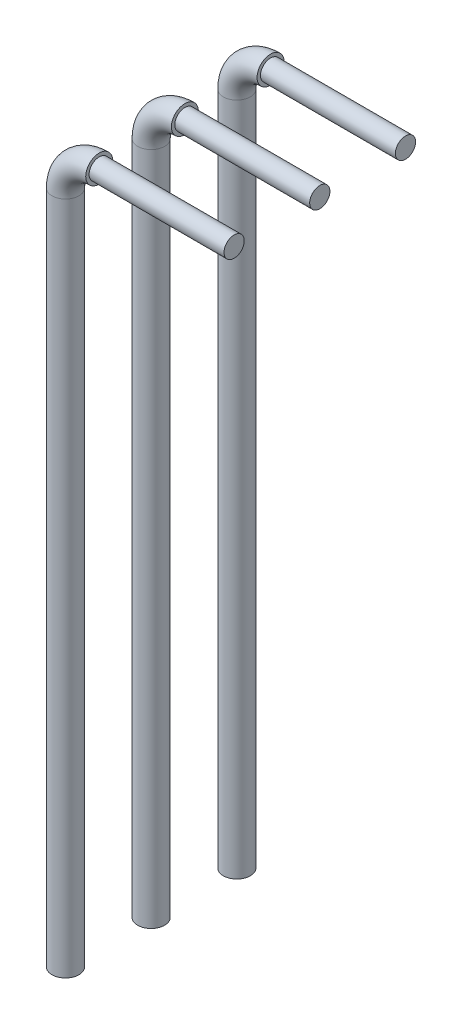
ISO-10303-21;
HEADER;
FILE_DESCRIPTION(('STEP AP214'),'2;1');
FILE_NAME('part.step','',(''),(''),'','','');
FILE_SCHEMA(('AUTOMOTIVE_DESIGN { 1 0 10303 214 1 1 1 1 }'));
ENDSEC;
DATA;
#1=APPLICATION_CONTEXT('core data for automotive mechanical design processes');
#2=APPLICATION_PROTOCOL_DEFINITION('international standard','automotive_design',2000,#1);
#3=PRODUCT_CONTEXT('',#1,'mechanical');
#4=PRODUCT('Part','Part','',(#3));
#5=PRODUCT_RELATED_PRODUCT_CATEGORY('part','',(#4));
#6=PRODUCT_DEFINITION_FORMATION('','',#4);
#7=PRODUCT_DEFINITION_CONTEXT('part definition',#1,'design');
#8=PRODUCT_DEFINITION('design','',#6,#7);
#9=PRODUCT_DEFINITION_SHAPE('','',#8);
#10=(LENGTH_UNIT() NAMED_UNIT(*) SI_UNIT(.MILLI.,.METRE.));
#11=(NAMED_UNIT(*) PLANE_ANGLE_UNIT() SI_UNIT($,.RADIAN.));
#12=(NAMED_UNIT(*) SI_UNIT($,.STERADIAN.) SOLID_ANGLE_UNIT());
#13=UNCERTAINTY_MEASURE_WITH_UNIT(LENGTH_MEASURE(1.E-05),#10,'distance_accuracy_value','');
#14=(GEOMETRIC_REPRESENTATION_CONTEXT(3) GLOBAL_UNCERTAINTY_ASSIGNED_CONTEXT((#13)) GLOBAL_UNIT_ASSIGNED_CONTEXT((#10,
#11,#12)) REPRESENTATION_CONTEXT('',''));
#15=CARTESIAN_POINT('',(0.,0.,0.));
#16=DIRECTION('',(0.,0.,1.));
#17=DIRECTION('',(1.,0.,0.));
#18=AXIS2_PLACEMENT_3D('',#15,#16,#17);
#19=CARTESIAN_POINT('',(1.0007043784199,20.9999997519255,-5.08));
#20=DIRECTION('',(0.99999975192549,-0.000704378419902238,0.));
#21=DIRECTION('',(0.,0.,1.));
#22=AXIS2_PLACEMENT_3D('',#19,#20,#21);
#23=PLANE('',#22);
#24=CARTESIAN_POINT('',(1.0007043784199,20.9999997519255,-5.08));
#25=DIRECTION('',(0.99999975192549,-0.000704378419902238,0.));
#26=DIRECTION('',(0.,0.,1.));
#27=AXIS2_PLACEMENT_3D('',#24,#25,#26);
#28=CIRCLE('',#27,0.4);
#29=CARTESIAN_POINT('',(1.00098612978786,21.3999996526957,-5.08));
#30=VERTEX_POINT('',#29);
#31=EDGE_CURVE('E11',#30,#30,#28,.T.);
#32=ORIENTED_EDGE('',*,*,#31,.T.);
#33=EDGE_LOOP('',(#32));
#34=FACE_BOUND('',#33,.T.);
#35=CARTESIAN_POINT('',(1.0007043784199,20.9999997519255,-5.08));
#36=DIRECTION('',(0.99999975192549,-0.000704378419902238,0.));
#37=DIRECTION('',(0.000704378419902238,0.99999975192549,0.));
#38=AXIS2_PLACEMENT_3D('',#35,#36,#37);
#39=CIRCLE('',#38,0.3);
#40=CARTESIAN_POINT('',(1.00091569194587,21.2999996775031,-5.08));
#41=VERTEX_POINT('',#40);
#42=EDGE_CURVE('E61',#41,#41,#39,.T.);
#43=ORIENTED_EDGE('',*,*,#42,.F.);
#44=EDGE_LOOP('',(#43));
#45=FACE_BOUND('',#44,.T.);
#46=ADVANCED_FACE('F43',(#34,#45),#23,.T.);
#47=CARTESIAN_POINT('',(1.,20.,-5.08));
#48=DIRECTION('',(0.,0.,-1.));
#49=DIRECTION('',(-1.,0.,0.));
#50=AXIS2_PLACEMENT_3D('',#47,#48,#49);
#51=TOROIDAL_SURFACE('',#50,1.,0.4);
#52=CARTESIAN_POINT('',(0.,20.,-5.08));
#53=DIRECTION('',(0.,1.,0.));
#54=DIRECTION('',(0.,0.,1.));
#55=AXIS2_PLACEMENT_3D('',#52,#53,#54);
#56=CIRCLE('',#55,0.4);
#57=CARTESIAN_POINT('',(-0.4,20.,-5.08));
#58=VERTEX_POINT('',#57);
#59=EDGE_CURVE('E50',#58,#58,#56,.T.);
#60=CARTESIAN_POINT('',(1.,20.,-5.08));
#61=DIRECTION('',(0.,0.,-1.));
#62=DIRECTION('',(-1.,0.,0.));
#63=AXIS2_PLACEMENT_3D('',#60,#61,#62);
#64=CIRCLE('',#63,1.4);
#65=EDGE_CURVE('',#58,#30,#64,.T.);
#66=ORIENTED_EDGE('',*,*,#59,.T.);
#67=ORIENTED_EDGE('',*,*,#31,.F.);
#68=ORIENTED_EDGE('',*,*,#65,.T.);
#69=ORIENTED_EDGE('',*,*,#65,.F.);
#70=EDGE_LOOP('',(#66,#68,#67,#69));
#71=FACE_BOUND('',#70,.T.);
#72=ADVANCED_FACE('F45',(#71),#51,.T.);
#73=CARTESIAN_POINT('',(0.,20.,-5.08));
#74=DIRECTION('',(0.,-1.,0.));
#75=DIRECTION('',(0.,0.,-1.));
#76=AXIS2_PLACEMENT_3D('',#73,#74,#75);
#77=CYLINDRICAL_SURFACE('',#76,0.4);
#78=ORIENTED_EDGE('',*,*,#59,.F.);
#79=EDGE_LOOP('',(#78));
#80=FACE_BOUND('',#79,.T.);
#81=CARTESIAN_POINT('',(0.,0.,-5.08));
#82=DIRECTION('',(0.,1.,0.));
#83=DIRECTION('',(0.,0.,1.));
#84=AXIS2_PLACEMENT_3D('',#81,#82,#83);
#85=CIRCLE('',#84,0.4);
#86=CARTESIAN_POINT('',(0.,0.,-4.68));
#87=VERTEX_POINT('',#86);
#88=EDGE_CURVE('E54',#87,#87,#85,.T.);
#89=ORIENTED_EDGE('',*,*,#88,.T.);
#90=EDGE_LOOP('',(#89));
#91=FACE_BOUND('',#90,.T.);
#92=ADVANCED_FACE('F81',(#80,#91),#77,.T.);
#93=CARTESIAN_POINT('',(0.,0.,-5.08));
#94=DIRECTION('',(0.,1.,0.));
#95=DIRECTION('',(0.,0.,1.));
#96=AXIS2_PLACEMENT_3D('',#93,#94,#95);
#97=PLANE('',#96);
#98=ORIENTED_EDGE('',*,*,#88,.F.);
#99=EDGE_LOOP('',(#98));
#100=FACE_BOUND('',#99,.T.);
#101=ADVANCED_FACE('F72',(#100),#97,.F.);
#102=CARTESIAN_POINT('',(5.00070338612186,20.9971822382459,-5.08));
#103=DIRECTION('',(-0.99999975192549,0.000704378419902238,0.));
#104=DIRECTION('',(-0.000704378419902238,-0.99999975192549,0.));
#105=AXIS2_PLACEMENT_3D('',#102,#103,#104);
#106=CYLINDRICAL_SURFACE('',#105,0.3);
#107=CARTESIAN_POINT('',(5.00070338612186,20.9971822382459,-5.08));
#108=DIRECTION('',(0.99999975192549,-0.000704378419902238,0.));
#109=DIRECTION('',(0.000704378419902238,0.99999975192549,0.));
#110=AXIS2_PLACEMENT_3D('',#107,#108,#109);
#111=CIRCLE('',#110,0.3);
#112=CARTESIAN_POINT('',(5.00091469964783,21.2971821638235,-5.08));
#113=VERTEX_POINT('',#112);
#114=EDGE_CURVE('E59',#113,#113,#111,.T.);
#115=ORIENTED_EDGE('',*,*,#114,.F.);
#116=EDGE_LOOP('',(#115));
#117=FACE_BOUND('',#116,.T.);
#118=ORIENTED_EDGE('',*,*,#42,.T.);
#119=EDGE_LOOP('',(#118));
#120=FACE_BOUND('',#119,.T.);
#121=ADVANCED_FACE('F69',(#117,#120),#106,.T.);
#122=CARTESIAN_POINT('',(5.00070338612186,20.9971822382459,-5.08));
#123=DIRECTION('',(0.99999975192549,-0.000704378419902238,0.));
#124=DIRECTION('',(0.000704378419902238,0.99999975192549,0.));
#125=AXIS2_PLACEMENT_3D('',#122,#123,#124);
#126=PLANE('',#125);
#127=ORIENTED_EDGE('',*,*,#114,.T.);
#128=EDGE_LOOP('',(#127));
#129=FACE_BOUND('',#128,.T.);
#130=ADVANCED_FACE('F67',(#129),#126,.T.);
#131=CLOSED_SHELL('',(#46,#72,#92,#101,#121,#130));
#132=MANIFOLD_SOLID_BREP('B2',#131);
#133=CARTESIAN_POINT('',(1.0007043784199,20.9999997519255,-2.54));
#134=DIRECTION('',(0.99999975192549,-0.000704378419902238,0.));
#135=DIRECTION('',(0.,0.,1.));
#136=AXIS2_PLACEMENT_3D('',#133,#134,#135);
#137=PLANE('',#136);
#138=CARTESIAN_POINT('',(1.0007043784199,20.9999997519255,-2.54));
#139=DIRECTION('',(0.99999975192549,-0.000704378419902238,0.));
#140=DIRECTION('',(0.,0.,1.));
#141=AXIS2_PLACEMENT_3D('',#138,#139,#140);
#142=CIRCLE('',#141,0.4);
#143=CARTESIAN_POINT('',(1.00098612978786,21.3999996526957,-2.54));
#144=VERTEX_POINT('',#143);
#145=EDGE_CURVE('E42',#144,#144,#142,.T.);
#146=ORIENTED_EDGE('',*,*,#145,.T.);
#147=EDGE_LOOP('',(#146));
#148=FACE_BOUND('',#147,.T.);
#149=CARTESIAN_POINT('',(1.0007043784199,20.9999997519255,-2.54));
#150=DIRECTION('',(0.99999975192549,-0.000704378419902238,0.));
#151=DIRECTION('',(0.000704378419902238,0.99999975192549,0.));
#152=AXIS2_PLACEMENT_3D('',#149,#150,#151);
#153=CIRCLE('',#152,0.3);
#154=CARTESIAN_POINT('',(1.00091569194587,21.2999996775031,-2.54));
#155=VERTEX_POINT('',#154);
#156=EDGE_CURVE('E165',#155,#155,#153,.T.);
#157=ORIENTED_EDGE('',*,*,#156,.F.);
#158=EDGE_LOOP('',(#157));
#159=FACE_BOUND('',#158,.T.);
#160=ADVANCED_FACE('F147',(#148,#159),#137,.T.);
#161=CARTESIAN_POINT('',(1.,20.,-2.54));
#162=DIRECTION('',(0.,0.,-1.));
#163=DIRECTION('',(-1.,0.,0.));
#164=AXIS2_PLACEMENT_3D('',#161,#162,#163);
#165=TOROIDAL_SURFACE('',#164,1.,0.4);
#166=CARTESIAN_POINT('',(0.,20.,-2.54));
#167=DIRECTION('',(0.,1.,0.));
#168=DIRECTION('',(0.,0.,1.));
#169=AXIS2_PLACEMENT_3D('',#166,#167,#168);
#170=CIRCLE('',#169,0.4);
#171=CARTESIAN_POINT('',(-0.4,20.,-2.54));
#172=VERTEX_POINT('',#171);
#173=EDGE_CURVE('E154',#172,#172,#170,.T.);
#174=CARTESIAN_POINT('',(1.,20.,-2.54));
#175=DIRECTION('',(0.,0.,-1.));
#176=DIRECTION('',(-1.,0.,0.));
#177=AXIS2_PLACEMENT_3D('',#174,#175,#176);
#178=CIRCLE('',#177,1.4);
#179=EDGE_CURVE('',#172,#144,#178,.T.);
#180=ORIENTED_EDGE('',*,*,#173,.T.);
#181=ORIENTED_EDGE('',*,*,#145,.F.);
#182=ORIENTED_EDGE('',*,*,#179,.T.);
#183=ORIENTED_EDGE('',*,*,#179,.F.);
#184=EDGE_LOOP('',(#180,#182,#181,#183));
#185=FACE_BOUND('',#184,.T.);
#186=ADVANCED_FACE('F149',(#185),#165,.T.);
#187=CARTESIAN_POINT('',(0.,20.,-2.54));
#188=DIRECTION('',(0.,-1.,0.));
#189=DIRECTION('',(0.,0.,-1.));
#190=AXIS2_PLACEMENT_3D('',#187,#188,#189);
#191=CYLINDRICAL_SURFACE('',#190,0.4);
#192=ORIENTED_EDGE('',*,*,#173,.F.);
#193=EDGE_LOOP('',(#192));
#194=FACE_BOUND('',#193,.T.);
#195=CARTESIAN_POINT('',(0.,0.,-2.54));
#196=DIRECTION('',(0.,1.,0.));
#197=DIRECTION('',(0.,0.,1.));
#198=AXIS2_PLACEMENT_3D('',#195,#196,#197);
#199=CIRCLE('',#198,0.4);
#200=CARTESIAN_POINT('',(0.,0.,-2.14));
#201=VERTEX_POINT('',#200);
#202=EDGE_CURVE('E158',#201,#201,#199,.T.);
#203=ORIENTED_EDGE('',*,*,#202,.T.);
#204=EDGE_LOOP('',(#203));
#205=FACE_BOUND('',#204,.T.);
#206=ADVANCED_FACE('F185',(#194,#205),#191,.T.);
#207=CARTESIAN_POINT('',(0.,0.,-2.54));
#208=DIRECTION('',(0.,1.,0.));
#209=DIRECTION('',(0.,0.,1.));
#210=AXIS2_PLACEMENT_3D('',#207,#208,#209);
#211=PLANE('',#210);
#212=ORIENTED_EDGE('',*,*,#202,.F.);
#213=EDGE_LOOP('',(#212));
#214=FACE_BOUND('',#213,.T.);
#215=ADVANCED_FACE('F176',(#214),#211,.F.);
#216=CARTESIAN_POINT('',(5.00070338612186,20.9971822382459,-2.54));
#217=DIRECTION('',(-0.99999975192549,0.000704378419902238,0.));
#218=DIRECTION('',(-0.000704378419902238,-0.99999975192549,0.));
#219=AXIS2_PLACEMENT_3D('',#216,#217,#218);
#220=CYLINDRICAL_SURFACE('',#219,0.3);
#221=CARTESIAN_POINT('',(5.00070338612186,20.9971822382459,-2.54));
#222=DIRECTION('',(0.99999975192549,-0.000704378419902238,0.));
#223=DIRECTION('',(0.000704378419902238,0.99999975192549,0.));
#224=AXIS2_PLACEMENT_3D('',#221,#222,#223);
#225=CIRCLE('',#224,0.3);
#226=CARTESIAN_POINT('',(5.00091469964783,21.2971821638235,-2.54));
#227=VERTEX_POINT('',#226);
#228=EDGE_CURVE('E163',#227,#227,#225,.T.);
#229=ORIENTED_EDGE('',*,*,#228,.F.);
#230=EDGE_LOOP('',(#229));
#231=FACE_BOUND('',#230,.T.);
#232=ORIENTED_EDGE('',*,*,#156,.T.);
#233=EDGE_LOOP('',(#232));
#234=FACE_BOUND('',#233,.T.);
#235=ADVANCED_FACE('F173',(#231,#234),#220,.T.);
#236=CARTESIAN_POINT('',(5.00070338612186,20.9971822382459,-2.54));
#237=DIRECTION('',(0.99999975192549,-0.000704378419902238,0.));
#238=DIRECTION('',(0.000704378419902238,0.99999975192549,0.));
#239=AXIS2_PLACEMENT_3D('',#236,#237,#238);
#240=PLANE('',#239);
#241=ORIENTED_EDGE('',*,*,#228,.T.);
#242=EDGE_LOOP('',(#241));
#243=FACE_BOUND('',#242,.T.);
#244=ADVANCED_FACE('F171',(#243),#240,.T.);
#245=CLOSED_SHELL('',(#160,#186,#206,#215,#235,#244));
#246=MANIFOLD_SOLID_BREP('B6',#245);
#247=CARTESIAN_POINT('',(1.0007043784199,20.9999997519255,0.));
#248=DIRECTION('',(0.99999975192549,-0.000704378419902238,0.));
#249=DIRECTION('',(0.,0.,1.));
#250=AXIS2_PLACEMENT_3D('',#247,#248,#249);
#251=PLANE('',#250);
#252=CARTESIAN_POINT('',(1.0007043784199,20.9999997519255,0.));
#253=DIRECTION('',(0.99999975192549,-0.000704378419902238,0.));
#254=DIRECTION('',(0.,0.,1.));
#255=AXIS2_PLACEMENT_3D('',#252,#253,#254);
#256=CIRCLE('',#255,0.4);
#257=CARTESIAN_POINT('',(1.00098612978786,21.3999996526957,0.));
#258=VERTEX_POINT('',#257);
#259=EDGE_CURVE('E146',#258,#258,#256,.T.);
#260=ORIENTED_EDGE('',*,*,#259,.T.);
#261=EDGE_LOOP('',(#260));
#262=FACE_BOUND('',#261,.T.);
#263=CARTESIAN_POINT('',(1.0007043784199,20.9999997519255,0.));
#264=DIRECTION('',(0.99999975192549,-0.000704378419902238,0.));
#265=DIRECTION('',(0.000704378419902238,0.99999975192549,0.));
#266=AXIS2_PLACEMENT_3D('',#263,#264,#265);
#267=CIRCLE('',#266,0.3);
#268=CARTESIAN_POINT('',(1.00091569194587,21.2999996775031,0.));
#269=VERTEX_POINT('',#268);
#270=EDGE_CURVE('E262',#269,#269,#267,.T.);
#271=ORIENTED_EDGE('',*,*,#270,.F.);
#272=EDGE_LOOP('',(#271));
#273=FACE_BOUND('',#272,.T.);
#274=ADVANCED_FACE('F244',(#262,#273),#251,.T.);
#275=CARTESIAN_POINT('',(1.,20.,0.));
#276=DIRECTION('',(0.,0.,-1.));
#277=DIRECTION('',(-1.,0.,0.));
#278=AXIS2_PLACEMENT_3D('',#275,#276,#277);
#279=TOROIDAL_SURFACE('',#278,1.,0.4);
#280=CARTESIAN_POINT('',(0.,20.,0.));
#281=DIRECTION('',(0.,1.,0.));
#282=DIRECTION('',(0.,0.,1.));
#283=AXIS2_PLACEMENT_3D('',#280,#281,#282);
#284=CIRCLE('',#283,0.4);
#285=CARTESIAN_POINT('',(-0.4,20.,0.));
#286=VERTEX_POINT('',#285);
#287=EDGE_CURVE('E251',#286,#286,#284,.T.);
#288=CARTESIAN_POINT('',(1.,20.,0.));
#289=DIRECTION('',(0.,0.,-1.));
#290=DIRECTION('',(-1.,0.,0.));
#291=AXIS2_PLACEMENT_3D('',#288,#289,#290);
#292=CIRCLE('',#291,1.4);
#293=EDGE_CURVE('',#286,#258,#292,.T.);
#294=ORIENTED_EDGE('',*,*,#287,.T.);
#295=ORIENTED_EDGE('',*,*,#259,.F.);
#296=ORIENTED_EDGE('',*,*,#293,.T.);
#297=ORIENTED_EDGE('',*,*,#293,.F.);
#298=EDGE_LOOP('',(#294,#296,#295,#297));
#299=FACE_BOUND('',#298,.T.);
#300=ADVANCED_FACE('F246',(#299),#279,.T.);
#301=CARTESIAN_POINT('',(0.,20.,0.));
#302=DIRECTION('',(0.,-1.,0.));
#303=DIRECTION('',(0.,0.,-1.));
#304=AXIS2_PLACEMENT_3D('',#301,#302,#303);
#305=CYLINDRICAL_SURFACE('',#304,0.4);
#306=ORIENTED_EDGE('',*,*,#287,.F.);
#307=EDGE_LOOP('',(#306));
#308=FACE_BOUND('',#307,.T.);
#309=CARTESIAN_POINT('',(0.,0.,0.));
#310=DIRECTION('',(0.,1.,0.));
#311=DIRECTION('',(0.,0.,1.));
#312=AXIS2_PLACEMENT_3D('',#309,#310,#311);
#313=CIRCLE('',#312,0.4);
#314=CARTESIAN_POINT('',(0.,0.,0.4));
#315=VERTEX_POINT('',#314);
#316=EDGE_CURVE('E255',#315,#315,#313,.T.);
#317=ORIENTED_EDGE('',*,*,#316,.T.);
#318=EDGE_LOOP('',(#317));
#319=FACE_BOUND('',#318,.T.);
#320=ADVANCED_FACE('F282',(#308,#319),#305,.T.);
#321=CARTESIAN_POINT('',(0.,0.,0.));
#322=DIRECTION('',(0.,1.,0.));
#323=DIRECTION('',(0.,0.,1.));
#324=AXIS2_PLACEMENT_3D('',#321,#322,#323);
#325=PLANE('',#324);
#326=ORIENTED_EDGE('',*,*,#316,.F.);
#327=EDGE_LOOP('',(#326));
#328=FACE_BOUND('',#327,.T.);
#329=ADVANCED_FACE('F273',(#328),#325,.F.);
#330=CARTESIAN_POINT('',(5.00070338612186,20.9971822382459,0.));
#331=DIRECTION('',(-0.99999975192549,0.000704378419902238,0.));
#332=DIRECTION('',(-0.000704378419902238,-0.99999975192549,0.));
#333=AXIS2_PLACEMENT_3D('',#330,#331,#332);
#334=CYLINDRICAL_SURFACE('',#333,0.3);
#335=CARTESIAN_POINT('',(5.00070338612186,20.9971822382459,0.));
#336=DIRECTION('',(0.99999975192549,-0.000704378419902238,0.));
#337=DIRECTION('',(0.000704378419902238,0.99999975192549,0.));
#338=AXIS2_PLACEMENT_3D('',#335,#336,#337);
#339=CIRCLE('',#338,0.3);
#340=CARTESIAN_POINT('',(5.00091469964783,21.2971821638235,0.));
#341=VERTEX_POINT('',#340);
#342=EDGE_CURVE('E260',#341,#341,#339,.T.);
#343=ORIENTED_EDGE('',*,*,#342,.F.);
#344=EDGE_LOOP('',(#343));
#345=FACE_BOUND('',#344,.T.);
#346=ORIENTED_EDGE('',*,*,#270,.T.);
#347=EDGE_LOOP('',(#346));
#348=FACE_BOUND('',#347,.T.);
#349=ADVANCED_FACE('F270',(#345,#348),#334,.T.);
#350=CARTESIAN_POINT('',(5.00070338612186,20.9971822382459,0.));
#351=DIRECTION('',(0.99999975192549,-0.000704378419902238,0.));
#352=DIRECTION('',(0.000704378419902238,0.99999975192549,0.));
#353=AXIS2_PLACEMENT_3D('',#350,#351,#352);
#354=PLANE('',#353);
#355=ORIENTED_EDGE('',*,*,#342,.T.);
#356=EDGE_LOOP('',(#355));
#357=FACE_BOUND('',#356,.T.);
#358=ADVANCED_FACE('F268',(#357),#354,.T.);
#359=CLOSED_SHELL('',(#274,#300,#320,#329,#349,#358));
#360=MANIFOLD_SOLID_BREP('B37',#359);
#361=ADVANCED_BREP_SHAPE_REPRESENTATION('',(#18,#132,#246,#360),#14);
#362=SHAPE_DEFINITION_REPRESENTATION(#9,#361);
ENDSEC;
END-ISO-10303-21;
